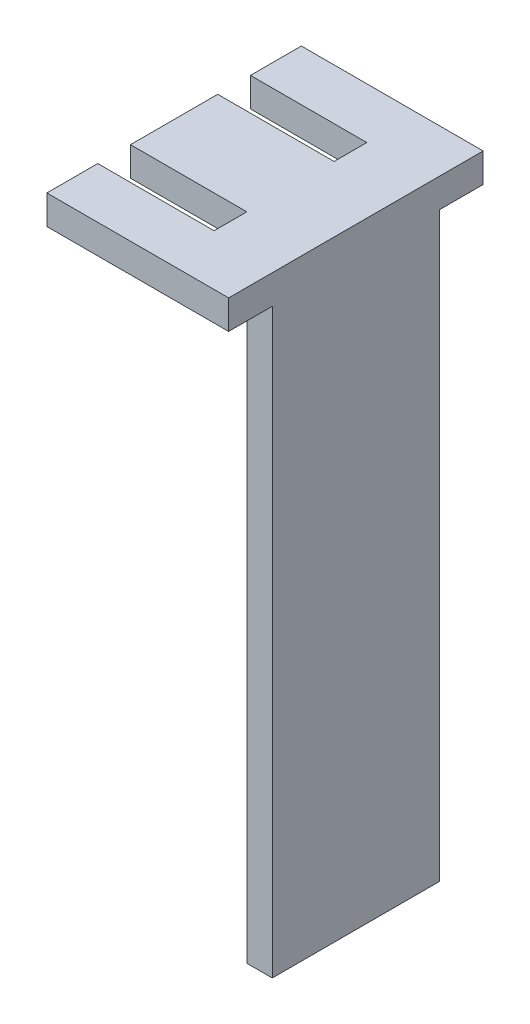
ISO-10303-21;
HEADER;
FILE_DESCRIPTION(('STEP AP214'),'2;1');
FILE_NAME('part.step','',(''),(''),'','','');
FILE_SCHEMA(('AUTOMOTIVE_DESIGN { 1 0 10303 214 1 1 1 1 }'));
ENDSEC;
DATA;
#1=APPLICATION_CONTEXT('core data for automotive mechanical design processes');
#2=APPLICATION_PROTOCOL_DEFINITION('international standard','automotive_design',2000,#1);
#3=PRODUCT_CONTEXT('',#1,'mechanical');
#4=PRODUCT('Part','Part','',(#3));
#5=PRODUCT_RELATED_PRODUCT_CATEGORY('part','',(#4));
#6=PRODUCT_DEFINITION_FORMATION('','',#4);
#7=PRODUCT_DEFINITION_CONTEXT('part definition',#1,'design');
#8=PRODUCT_DEFINITION('design','',#6,#7);
#9=PRODUCT_DEFINITION_SHAPE('','',#8);
#10=(LENGTH_UNIT() NAMED_UNIT(*) SI_UNIT(.MILLI.,.METRE.));
#11=(NAMED_UNIT(*) PLANE_ANGLE_UNIT() SI_UNIT($,.RADIAN.));
#12=(NAMED_UNIT(*) SI_UNIT($,.STERADIAN.) SOLID_ANGLE_UNIT());
#13=UNCERTAINTY_MEASURE_WITH_UNIT(LENGTH_MEASURE(1.E-05),#10,'distance_accuracy_value','');
#14=(GEOMETRIC_REPRESENTATION_CONTEXT(3) GLOBAL_UNCERTAINTY_ASSIGNED_CONTEXT((#13)) GLOBAL_UNIT_ASSIGNED_CONTEXT((#10,
#11,#12)) REPRESENTATION_CONTEXT('',''));
#15=CARTESIAN_POINT('',(0.,0.,0.));
#16=DIRECTION('',(0.,0.,1.));
#17=DIRECTION('',(1.,0.,0.));
#18=AXIS2_PLACEMENT_3D('',#15,#16,#17);
#19=CARTESIAN_POINT('',(0.,0.,0.));
#20=DIRECTION('',(0.,1.,0.));
#21=DIRECTION('',(0.,0.,1.));
#22=AXIS2_PLACEMENT_3D('',#19,#20,#21);
#23=PLANE('',#22);
#24=DIRECTION('',(-1.,0.,0.));
#25=VECTOR('',#24,1.);
#26=CARTESIAN_POINT('',(11.6483050847458,0.,16.3411016949152));
#27=LINE('',#26,#25);
#28=CARTESIAN_POINT('',(15.1483050847458,0.,16.3411016949152));
#29=VERTEX_POINT('',#28);
#30=CARTESIAN_POINT('',(11.6483050847458,0.,16.3411016949152));
#31=VERTEX_POINT('',#30);
#32=EDGE_CURVE('E169',#29,#31,#27,.T.);
#33=ORIENTED_EDGE('',*,*,#32,.F.);
#34=DIRECTION('',(0.,0.,-1.));
#35=VECTOR('',#34,1.);
#36=CARTESIAN_POINT('',(15.1483050847458,0.,-12.6588983050848));
#37=LINE('',#36,#35);
#38=CARTESIAN_POINT('',(15.1483050847458,0.,22.3411016949152));
#39=VERTEX_POINT('',#38);
#40=EDGE_CURVE('E249',#39,#29,#37,.T.);
#41=ORIENTED_EDGE('',*,*,#40,.F.);
#42=DIRECTION('',(1.,0.,0.));
#43=VECTOR('',#42,1.);
#44=CARTESIAN_POINT('',(-9.85169491525423,0.,22.3411016949152));
#45=LINE('',#44,#43);
#46=CARTESIAN_POINT('',(-9.85169491525423,0.,22.3411016949152));
#47=VERTEX_POINT('',#46);
#48=EDGE_CURVE('E245',#47,#39,#45,.T.);
#49=ORIENTED_EDGE('',*,*,#48,.F.);
#50=DIRECTION('',(0.,0.,1.));
#51=VECTOR('',#50,1.);
#52=CARTESIAN_POINT('',(-9.85169491525423,0.,-12.6588983050848));
#53=LINE('',#52,#51);
#54=CARTESIAN_POINT('',(-9.85169491525423,0.,15.3411016949152));
#55=VERTEX_POINT('',#54);
#56=EDGE_CURVE('E203',#55,#47,#53,.T.);
#57=ORIENTED_EDGE('',*,*,#56,.F.);
#58=DIRECTION('',(1.,0.,0.));
#59=VECTOR('',#58,1.);
#60=CARTESIAN_POINT('',(-9.85169491525423,0.,15.3411016949152));
#61=LINE('',#60,#59);
#62=CARTESIAN_POINT('',(6.14830508474577,0.,15.3411016949152));
#63=VERTEX_POINT('',#62);
#64=EDGE_CURVE('E181',#55,#63,#61,.T.);
#65=ORIENTED_EDGE('',*,*,#64,.T.);
#66=DIRECTION('',(0.,0.,-1.));
#67=VECTOR('',#66,1.);
#68=CARTESIAN_POINT('',(6.14830508474577,0.,10.8411016949152));
#69=LINE('',#68,#67);
#70=CARTESIAN_POINT('',(6.14830508474577,0.,10.8411016949152));
#71=VERTEX_POINT('',#70);
#72=EDGE_CURVE('E184',#63,#71,#69,.T.);
#73=ORIENTED_EDGE('',*,*,#72,.T.);
#74=DIRECTION('',(-1.,0.,0.));
#75=VECTOR('',#74,1.);
#76=CARTESIAN_POINT('',(-9.85169491525423,0.,10.8411016949152));
#77=LINE('',#76,#75);
#78=CARTESIAN_POINT('',(-9.85169491525423,0.,10.8411016949152));
#79=VERTEX_POINT('',#78);
#80=EDGE_CURVE('E188',#71,#79,#77,.T.);
#81=ORIENTED_EDGE('',*,*,#80,.T.);
#82=CARTESIAN_POINT('',(-9.85169491525423,0.,-1.15889830508476));
#83=VERTEX_POINT('',#82);
#84=EDGE_CURVE('E246',#83,#79,#53,.T.);
#85=ORIENTED_EDGE('',*,*,#84,.F.);
#86=DIRECTION('',(1.,0.,0.));
#87=VECTOR('',#86,1.);
#88=CARTESIAN_POINT('',(-9.85169491525423,0.,-1.15889830508476));
#89=LINE('',#88,#87);
#90=CARTESIAN_POINT('',(6.14830508474577,0.,-1.15889830508476));
#91=VERTEX_POINT('',#90);
#92=EDGE_CURVE('E218',#83,#91,#89,.T.);
#93=ORIENTED_EDGE('',*,*,#92,.T.);
#94=DIRECTION('',(0.,0.,-1.));
#95=VECTOR('',#94,1.);
#96=CARTESIAN_POINT('',(6.14830508474577,0.,-5.65889830508476));
#97=LINE('',#96,#95);
#98=CARTESIAN_POINT('',(6.14830508474577,0.,-5.65889830508476));
#99=VERTEX_POINT('',#98);
#100=EDGE_CURVE('E225',#91,#99,#97,.T.);
#101=ORIENTED_EDGE('',*,*,#100,.T.);
#102=DIRECTION('',(-1.,0.,0.));
#103=VECTOR('',#102,1.);
#104=CARTESIAN_POINT('',(-9.85169491525423,0.,-5.65889830508476));
#105=LINE('',#104,#103);
#106=CARTESIAN_POINT('',(-9.85169491525423,0.,-5.65889830508476));
#107=VERTEX_POINT('',#106);
#108=EDGE_CURVE('E211',#99,#107,#105,.T.);
#109=ORIENTED_EDGE('',*,*,#108,.T.);
#110=CARTESIAN_POINT('',(-9.85169491525423,0.,-12.6588983050848));
#111=VERTEX_POINT('',#110);
#112=EDGE_CURVE('E242',#111,#107,#53,.T.);
#113=ORIENTED_EDGE('',*,*,#112,.F.);
#114=DIRECTION('',(-1.,0.,0.));
#115=VECTOR('',#114,1.);
#116=CARTESIAN_POINT('',(-9.85169491525423,0.,-12.6588983050848));
#117=LINE('',#116,#115);
#118=CARTESIAN_POINT('',(15.1483050847458,0.,-12.6588983050848));
#119=VERTEX_POINT('',#118);
#120=EDGE_CURVE('E252',#119,#111,#117,.T.);
#121=ORIENTED_EDGE('',*,*,#120,.F.);
#122=CARTESIAN_POINT('',(15.1483050847458,0.,-6.65889830508475));
#123=VERTEX_POINT('',#122);
#124=EDGE_CURVE('E248',#123,#119,#37,.T.);
#125=ORIENTED_EDGE('',*,*,#124,.F.);
#126=DIRECTION('',(1.,0.,0.));
#127=VECTOR('',#126,1.);
#128=CARTESIAN_POINT('',(11.6483050847458,0.,-6.65889830508475));
#129=LINE('',#128,#127);
#130=CARTESIAN_POINT('',(11.6483050847458,0.,-6.65889830508475));
#131=VERTEX_POINT('',#130);
#132=EDGE_CURVE('E59',#131,#123,#129,.T.);
#133=ORIENTED_EDGE('',*,*,#132,.F.);
#134=DIRECTION('',(0.,0.,-1.));
#135=VECTOR('',#134,1.);
#136=CARTESIAN_POINT('',(11.6483050847458,0.,16.3411016949152));
#137=LINE('',#136,#135);
#138=EDGE_CURVE('E54',#31,#131,#137,.T.);
#139=ORIENTED_EDGE('',*,*,#138,.F.);
#140=EDGE_LOOP('',(#33,#41,#49,#57,#65,#73,#81,#85,#93,#101,#109,#113,#121,#125,#133,#139));
#141=FACE_BOUND('',#140,.T.);
#142=ADVANCED_FACE('F39',(#141),#23,.F.);
#143=CARTESIAN_POINT('',(-9.85169491525423,4.,-12.6588983050848));
#144=DIRECTION('',(1.,0.,0.));
#145=DIRECTION('',(0.,0.,-1.));
#146=AXIS2_PLACEMENT_3D('',#143,#144,#145);
#147=PLANE('',#146);
#148=ORIENTED_EDGE('',*,*,#84,.T.);
#149=DIRECTION('',(0.,1.,0.));
#150=VECTOR('',#149,1.);
#151=CARTESIAN_POINT('',(-9.85169491525423,0.,10.8411016949152));
#152=LINE('',#151,#150);
#153=CARTESIAN_POINT('',(-9.85169491525423,4.,10.8411016949152));
#154=VERTEX_POINT('',#153);
#155=EDGE_CURVE('E200',#79,#154,#152,.T.);
#156=ORIENTED_EDGE('',*,*,#155,.T.);
#157=DIRECTION('',(0.,0.,1.));
#158=VECTOR('',#157,1.);
#159=CARTESIAN_POINT('',(-9.85169491525423,4.,-12.6588983050848));
#160=LINE('',#159,#158);
#161=CARTESIAN_POINT('',(-9.85169491525423,4.,-1.15889830508476));
#162=VERTEX_POINT('',#161);
#163=EDGE_CURVE('E234',#162,#154,#160,.T.);
#164=ORIENTED_EDGE('',*,*,#163,.F.);
#165=DIRECTION('',(0.,1.,0.));
#166=VECTOR('',#165,1.);
#167=CARTESIAN_POINT('',(-9.85169491525423,0.,-1.15889830508476));
#168=LINE('',#167,#166);
#169=EDGE_CURVE('E209',#83,#162,#168,.T.);
#170=ORIENTED_EDGE('',*,*,#169,.F.);
#171=EDGE_LOOP('',(#148,#156,#164,#170));
#172=FACE_BOUND('',#171,.T.);
#173=ADVANCED_FACE('F305',(#172),#147,.F.);
#174=ORIENTED_EDGE('',*,*,#112,.T.);
#175=DIRECTION('',(0.,1.,0.));
#176=VECTOR('',#175,1.);
#177=CARTESIAN_POINT('',(-9.85169491525423,0.,-5.65889830508476));
#178=LINE('',#177,#176);
#179=CARTESIAN_POINT('',(-9.85169491525423,4.,-5.65889830508476));
#180=VERTEX_POINT('',#179);
#181=EDGE_CURVE('E172',#107,#180,#178,.T.);
#182=ORIENTED_EDGE('',*,*,#181,.T.);
#183=CARTESIAN_POINT('',(-9.85169491525423,4.,-12.6588983050848));
#184=VERTEX_POINT('',#183);
#185=EDGE_CURVE('E230',#184,#180,#160,.T.);
#186=ORIENTED_EDGE('',*,*,#185,.F.);
#187=DIRECTION('',(0.,-1.,0.));
#188=VECTOR('',#187,1.);
#189=CARTESIAN_POINT('',(-9.85169491525423,4.,-12.6588983050848));
#190=LINE('',#189,#188);
#191=EDGE_CURVE('E241',#184,#111,#190,.T.);
#192=ORIENTED_EDGE('',*,*,#191,.T.);
#193=EDGE_LOOP('',(#174,#182,#186,#192));
#194=FACE_BOUND('',#193,.T.);
#195=ADVANCED_FACE('F288',(#194),#147,.F.);
#196=CARTESIAN_POINT('',(-9.85169491525423,4.,15.3411016949152));
#197=VERTEX_POINT('',#196);
#198=CARTESIAN_POINT('',(-9.85169491525423,4.,22.3411016949152));
#199=VERTEX_POINT('',#198);
#200=EDGE_CURVE('E235',#197,#199,#160,.T.);
#201=ORIENTED_EDGE('',*,*,#200,.F.);
#202=DIRECTION('',(0.,1.,0.));
#203=VECTOR('',#202,1.);
#204=CARTESIAN_POINT('',(-9.85169491525423,0.,15.3411016949152));
#205=LINE('',#204,#203);
#206=EDGE_CURVE('E191',#55,#197,#205,.T.);
#207=ORIENTED_EDGE('',*,*,#206,.F.);
#208=ORIENTED_EDGE('',*,*,#56,.T.);
#209=DIRECTION('',(0.,-1.,0.));
#210=VECTOR('',#209,1.);
#211=CARTESIAN_POINT('',(-9.85169491525423,4.,22.3411016949152));
#212=LINE('',#211,#210);
#213=EDGE_CURVE('E11',#199,#47,#212,.T.);
#214=ORIENTED_EDGE('',*,*,#213,.F.);
#215=EDGE_LOOP('',(#201,#207,#208,#214));
#216=FACE_BOUND('',#215,.T.);
#217=ADVANCED_FACE('F41',(#216),#147,.F.);
#218=CARTESIAN_POINT('',(-9.85169491525423,4.,22.3411016949152));
#219=DIRECTION('',(0.,0.,-1.));
#220=DIRECTION('',(-1.,0.,0.));
#221=AXIS2_PLACEMENT_3D('',#218,#219,#220);
#222=PLANE('',#221);
#223=ORIENTED_EDGE('',*,*,#48,.T.);
#224=DIRECTION('',(0.,-1.,0.));
#225=VECTOR('',#224,1.);
#226=CARTESIAN_POINT('',(15.1483050847458,4.,22.3411016949152));
#227=LINE('',#226,#225);
#228=CARTESIAN_POINT('',(15.1483050847458,4.,22.3411016949152));
#229=VERTEX_POINT('',#228);
#230=EDGE_CURVE('E47',#229,#39,#227,.T.);
#231=ORIENTED_EDGE('',*,*,#230,.F.);
#232=DIRECTION('',(1.,0.,0.));
#233=VECTOR('',#232,1.);
#234=CARTESIAN_POINT('',(-9.85169491525423,4.,22.3411016949152));
#235=LINE('',#234,#233);
#236=EDGE_CURVE('E233',#199,#229,#235,.T.);
#237=ORIENTED_EDGE('',*,*,#236,.F.);
#238=ORIENTED_EDGE('',*,*,#213,.T.);
#239=EDGE_LOOP('',(#223,#231,#237,#238));
#240=FACE_BOUND('',#239,.T.);
#241=ADVANCED_FACE('F298',(#240),#222,.F.);
#242=CARTESIAN_POINT('',(15.1483050847458,4.,-12.6588983050848));
#243=DIRECTION('',(-1.,0.,0.));
#244=DIRECTION('',(0.,0.,1.));
#245=AXIS2_PLACEMENT_3D('',#242,#243,#244);
#246=PLANE('',#245);
#247=ORIENTED_EDGE('',*,*,#40,.T.);
#248=DIRECTION('',(0.,1.,0.));
#249=VECTOR('',#248,1.);
#250=CARTESIAN_POINT('',(15.1483050847458,-80.,16.3411016949152));
#251=LINE('',#250,#249);
#252=CARTESIAN_POINT('',(15.1483050847458,-80.,16.3411016949152));
#253=VERTEX_POINT('',#252);
#254=EDGE_CURVE('E177',#253,#29,#251,.T.);
#255=ORIENTED_EDGE('',*,*,#254,.F.);
#256=DIRECTION('',(0.,0.,1.));
#257=VECTOR('',#256,1.);
#258=CARTESIAN_POINT('',(15.1483050847458,-80.,16.3411016949152));
#259=LINE('',#258,#257);
#260=CARTESIAN_POINT('',(15.1483050847458,-80.,-6.65889830508475));
#261=VERTEX_POINT('',#260);
#262=EDGE_CURVE('E159',#261,#253,#259,.T.);
#263=ORIENTED_EDGE('',*,*,#262,.F.);
#264=DIRECTION('',(0.,1.,0.));
#265=VECTOR('',#264,1.);
#266=CARTESIAN_POINT('',(15.1483050847458,-80.,-6.65889830508475));
#267=LINE('',#266,#265);
#268=EDGE_CURVE('E156',#261,#123,#267,.T.);
#269=ORIENTED_EDGE('',*,*,#268,.T.);
#270=ORIENTED_EDGE('',*,*,#124,.T.);
#271=DIRECTION('',(0.,-1.,0.));
#272=VECTOR('',#271,1.);
#273=CARTESIAN_POINT('',(15.1483050847458,4.,-12.6588983050848));
#274=LINE('',#273,#272);
#275=CARTESIAN_POINT('',(15.1483050847458,4.,-12.6588983050848));
#276=VERTEX_POINT('',#275);
#277=EDGE_CURVE('E256',#276,#119,#274,.T.);
#278=ORIENTED_EDGE('',*,*,#277,.F.);
#279=DIRECTION('',(0.,0.,-1.));
#280=VECTOR('',#279,1.);
#281=CARTESIAN_POINT('',(15.1483050847458,4.,-12.6588983050848));
#282=LINE('',#281,#280);
#283=EDGE_CURVE('E237',#229,#276,#282,.T.);
#284=ORIENTED_EDGE('',*,*,#283,.F.);
#285=ORIENTED_EDGE('',*,*,#230,.T.);
#286=EDGE_LOOP('',(#247,#255,#263,#269,#270,#278,#284,#285));
#287=FACE_BOUND('',#286,.T.);
#288=ADVANCED_FACE('F263',(#287),#246,.F.);
#289=CARTESIAN_POINT('',(-9.85169491525423,4.,-12.6588983050848));
#290=DIRECTION('',(0.,0.,1.));
#291=DIRECTION('',(1.,0.,0.));
#292=AXIS2_PLACEMENT_3D('',#289,#290,#291);
#293=PLANE('',#292);
#294=ORIENTED_EDGE('',*,*,#120,.T.);
#295=ORIENTED_EDGE('',*,*,#191,.F.);
#296=DIRECTION('',(-1.,0.,0.));
#297=VECTOR('',#296,1.);
#298=CARTESIAN_POINT('',(-9.85169491525423,4.,-12.6588983050848));
#299=LINE('',#298,#297);
#300=EDGE_CURVE('E239',#276,#184,#299,.T.);
#301=ORIENTED_EDGE('',*,*,#300,.F.);
#302=ORIENTED_EDGE('',*,*,#277,.T.);
#303=EDGE_LOOP('',(#294,#295,#301,#302));
#304=FACE_BOUND('',#303,.T.);
#305=ADVANCED_FACE('F283',(#304),#293,.F.);
#306=CARTESIAN_POINT('',(0.,4.,0.));
#307=DIRECTION('',(0.,1.,0.));
#308=DIRECTION('',(0.,0.,1.));
#309=AXIS2_PLACEMENT_3D('',#306,#307,#308);
#310=PLANE('',#309);
#311=DIRECTION('',(-1.,0.,0.));
#312=VECTOR('',#311,1.);
#313=CARTESIAN_POINT('',(-9.85169491525423,4.,10.8411016949152));
#314=LINE('',#313,#312);
#315=CARTESIAN_POINT('',(6.14830508474577,4.,10.8411016949152));
#316=VERTEX_POINT('',#315);
#317=EDGE_CURVE('E185',#316,#154,#314,.T.);
#318=ORIENTED_EDGE('',*,*,#317,.F.);
#319=DIRECTION('',(0.,0.,-1.));
#320=VECTOR('',#319,1.);
#321=CARTESIAN_POINT('',(6.14830508474577,4.,10.8411016949152));
#322=LINE('',#321,#320);
#323=CARTESIAN_POINT('',(6.14830508474577,4.,15.3411016949152));
#324=VERTEX_POINT('',#323);
#325=EDGE_CURVE('E195',#324,#316,#322,.T.);
#326=ORIENTED_EDGE('',*,*,#325,.F.);
#327=DIRECTION('',(1.,0.,0.));
#328=VECTOR('',#327,1.);
#329=CARTESIAN_POINT('',(-9.85169491525423,4.,15.3411016949152));
#330=LINE('',#329,#328);
#331=EDGE_CURVE('E192',#197,#324,#330,.T.);
#332=ORIENTED_EDGE('',*,*,#331,.F.);
#333=ORIENTED_EDGE('',*,*,#200,.T.);
#334=ORIENTED_EDGE('',*,*,#236,.T.);
#335=ORIENTED_EDGE('',*,*,#283,.T.);
#336=ORIENTED_EDGE('',*,*,#300,.T.);
#337=ORIENTED_EDGE('',*,*,#185,.T.);
#338=DIRECTION('',(-1.,0.,0.));
#339=VECTOR('',#338,1.);
#340=CARTESIAN_POINT('',(-9.85169491525423,4.,-5.65889830508476));
#341=LINE('',#340,#339);
#342=CARTESIAN_POINT('',(6.14830508474577,4.,-5.65889830508476));
#343=VERTEX_POINT('',#342);
#344=EDGE_CURVE('E215',#343,#180,#341,.T.);
#345=ORIENTED_EDGE('',*,*,#344,.F.);
#346=DIRECTION('',(0.,0.,-1.));
#347=VECTOR('',#346,1.);
#348=CARTESIAN_POINT('',(6.14830508474577,4.,-5.65889830508476));
#349=LINE('',#348,#347);
#350=CARTESIAN_POINT('',(6.14830508474577,4.,-1.15889830508476));
#351=VERTEX_POINT('',#350);
#352=EDGE_CURVE('E217',#351,#343,#349,.T.);
#353=ORIENTED_EDGE('',*,*,#352,.F.);
#354=DIRECTION('',(1.,0.,0.));
#355=VECTOR('',#354,1.);
#356=CARTESIAN_POINT('',(-9.85169491525423,4.,-1.15889830508476));
#357=LINE('',#356,#355);
#358=EDGE_CURVE('E196',#162,#351,#357,.T.);
#359=ORIENTED_EDGE('',*,*,#358,.F.);
#360=ORIENTED_EDGE('',*,*,#163,.T.);
#361=EDGE_LOOP('',(#318,#326,#332,#333,#334,#335,#336,#337,#345,#353,#359,#360));
#362=FACE_BOUND('',#361,.T.);
#363=ADVANCED_FACE('F293',(#362),#310,.T.);
#364=CARTESIAN_POINT('',(-9.85169491525423,0.,-5.65889830508476));
#365=DIRECTION('',(0.,0.,-1.));
#366=DIRECTION('',(-1.,0.,0.));
#367=AXIS2_PLACEMENT_3D('',#364,#365,#366);
#368=PLANE('',#367);
#369=ORIENTED_EDGE('',*,*,#344,.T.);
#370=ORIENTED_EDGE('',*,*,#181,.F.);
#371=ORIENTED_EDGE('',*,*,#108,.F.);
#372=DIRECTION('',(0.,1.,0.));
#373=VECTOR('',#372,1.);
#374=CARTESIAN_POINT('',(6.14830508474577,0.,-5.65889830508476));
#375=LINE('',#374,#373);
#376=EDGE_CURVE('E175',#99,#343,#375,.T.);
#377=ORIENTED_EDGE('',*,*,#376,.T.);
#378=EDGE_LOOP('',(#369,#370,#371,#377));
#379=FACE_BOUND('',#378,.T.);
#380=ADVANCED_FACE('F319',(#379),#368,.F.);
#381=CARTESIAN_POINT('',(6.14830508474577,0.,-5.65889830508476));
#382=DIRECTION('',(1.,0.,0.));
#383=DIRECTION('',(0.,0.,-1.));
#384=AXIS2_PLACEMENT_3D('',#381,#382,#383);
#385=PLANE('',#384);
#386=ORIENTED_EDGE('',*,*,#352,.T.);
#387=ORIENTED_EDGE('',*,*,#376,.F.);
#388=ORIENTED_EDGE('',*,*,#100,.F.);
#389=DIRECTION('',(0.,1.,0.));
#390=VECTOR('',#389,1.);
#391=CARTESIAN_POINT('',(6.14830508474577,0.,-1.15889830508476));
#392=LINE('',#391,#390);
#393=EDGE_CURVE('E212',#91,#351,#392,.T.);
#394=ORIENTED_EDGE('',*,*,#393,.T.);
#395=EDGE_LOOP('',(#386,#387,#388,#394));
#396=FACE_BOUND('',#395,.T.);
#397=ADVANCED_FACE('F317',(#396),#385,.F.);
#398=CARTESIAN_POINT('',(-9.85169491525423,0.,-1.15889830508476));
#399=DIRECTION('',(0.,0.,1.));
#400=DIRECTION('',(1.,0.,0.));
#401=AXIS2_PLACEMENT_3D('',#398,#399,#400);
#402=PLANE('',#401);
#403=ORIENTED_EDGE('',*,*,#358,.T.);
#404=ORIENTED_EDGE('',*,*,#393,.F.);
#405=ORIENTED_EDGE('',*,*,#92,.F.);
#406=ORIENTED_EDGE('',*,*,#169,.T.);
#407=EDGE_LOOP('',(#403,#404,#405,#406));
#408=FACE_BOUND('',#407,.T.);
#409=ADVANCED_FACE('F315',(#408),#402,.F.);
#410=CARTESIAN_POINT('',(-9.85169491525423,0.,10.8411016949152));
#411=DIRECTION('',(0.,0.,-1.));
#412=DIRECTION('',(-1.,0.,0.));
#413=AXIS2_PLACEMENT_3D('',#410,#411,#412);
#414=PLANE('',#413);
#415=ORIENTED_EDGE('',*,*,#317,.T.);
#416=ORIENTED_EDGE('',*,*,#155,.F.);
#417=ORIENTED_EDGE('',*,*,#80,.F.);
#418=DIRECTION('',(0.,1.,0.));
#419=VECTOR('',#418,1.);
#420=CARTESIAN_POINT('',(6.14830508474577,0.,10.8411016949152));
#421=LINE('',#420,#419);
#422=EDGE_CURVE('E204',#71,#316,#421,.T.);
#423=ORIENTED_EDGE('',*,*,#422,.T.);
#424=EDGE_LOOP('',(#415,#416,#417,#423));
#425=FACE_BOUND('',#424,.T.);
#426=ADVANCED_FACE('F310',(#425),#414,.F.);
#427=CARTESIAN_POINT('',(6.14830508474577,0.,10.8411016949152));
#428=DIRECTION('',(1.,0.,0.));
#429=DIRECTION('',(0.,0.,-1.));
#430=AXIS2_PLACEMENT_3D('',#427,#428,#429);
#431=PLANE('',#430);
#432=ORIENTED_EDGE('',*,*,#325,.T.);
#433=ORIENTED_EDGE('',*,*,#422,.F.);
#434=ORIENTED_EDGE('',*,*,#72,.F.);
#435=DIRECTION('',(0.,1.,0.));
#436=VECTOR('',#435,1.);
#437=CARTESIAN_POINT('',(6.14830508474577,0.,15.3411016949152));
#438=LINE('',#437,#436);
#439=EDGE_CURVE('E206',#63,#324,#438,.T.);
#440=ORIENTED_EDGE('',*,*,#439,.T.);
#441=EDGE_LOOP('',(#432,#433,#434,#440));
#442=FACE_BOUND('',#441,.T.);
#443=ADVANCED_FACE('F398',(#442),#431,.F.);
#444=CARTESIAN_POINT('',(-9.85169491525423,0.,15.3411016949152));
#445=DIRECTION('',(0.,0.,1.));
#446=DIRECTION('',(1.,0.,0.));
#447=AXIS2_PLACEMENT_3D('',#444,#445,#446);
#448=PLANE('',#447);
#449=ORIENTED_EDGE('',*,*,#331,.T.);
#450=ORIENTED_EDGE('',*,*,#439,.F.);
#451=ORIENTED_EDGE('',*,*,#64,.F.);
#452=ORIENTED_EDGE('',*,*,#206,.T.);
#453=EDGE_LOOP('',(#449,#450,#451,#452));
#454=FACE_BOUND('',#453,.T.);
#455=ADVANCED_FACE('F407',(#454),#448,.F.);
#456=CARTESIAN_POINT('',(11.6483050847458,-80.,16.3411016949152));
#457=DIRECTION('',(1.,0.,0.));
#458=DIRECTION('',(0.,0.,-1.));
#459=AXIS2_PLACEMENT_3D('',#456,#457,#458);
#460=PLANE('',#459);
#461=ORIENTED_EDGE('',*,*,#138,.T.);
#462=DIRECTION('',(0.,1.,0.));
#463=VECTOR('',#462,1.);
#464=CARTESIAN_POINT('',(11.6483050847458,-80.,-6.65889830508475));
#465=LINE('',#464,#463);
#466=CARTESIAN_POINT('',(11.6483050847458,-80.,-6.65889830508475));
#467=VERTEX_POINT('',#466);
#468=EDGE_CURVE('E154',#467,#131,#465,.T.);
#469=ORIENTED_EDGE('',*,*,#468,.F.);
#470=DIRECTION('',(0.,0.,-1.));
#471=VECTOR('',#470,1.);
#472=CARTESIAN_POINT('',(11.6483050847458,-80.,16.3411016949152));
#473=LINE('',#472,#471);
#474=CARTESIAN_POINT('',(11.6483050847458,-80.,16.3411016949152));
#475=VERTEX_POINT('',#474);
#476=EDGE_CURVE('E160',#475,#467,#473,.T.);
#477=ORIENTED_EDGE('',*,*,#476,.F.);
#478=DIRECTION('',(0.,1.,0.));
#479=VECTOR('',#478,1.);
#480=CARTESIAN_POINT('',(11.6483050847458,-80.,16.3411016949152));
#481=LINE('',#480,#479);
#482=EDGE_CURVE('E276',#475,#31,#481,.T.);
#483=ORIENTED_EDGE('',*,*,#482,.T.);
#484=EDGE_LOOP('',(#461,#469,#477,#483));
#485=FACE_BOUND('',#484,.T.);
#486=ADVANCED_FACE('F171',(#485),#460,.F.);
#487=CARTESIAN_POINT('',(11.6483050847458,-80.,-6.65889830508475));
#488=DIRECTION('',(0.,0.,1.));
#489=DIRECTION('',(1.,0.,0.));
#490=AXIS2_PLACEMENT_3D('',#487,#488,#489);
#491=PLANE('',#490);
#492=ORIENTED_EDGE('',*,*,#132,.T.);
#493=ORIENTED_EDGE('',*,*,#268,.F.);
#494=DIRECTION('',(1.,0.,0.));
#495=VECTOR('',#494,1.);
#496=CARTESIAN_POINT('',(11.6483050847458,-80.,-6.65889830508475));
#497=LINE('',#496,#495);
#498=EDGE_CURVE('E150',#467,#261,#497,.T.);
#499=ORIENTED_EDGE('',*,*,#498,.F.);
#500=ORIENTED_EDGE('',*,*,#468,.T.);
#501=EDGE_LOOP('',(#492,#493,#499,#500));
#502=FACE_BOUND('',#501,.T.);
#503=ADVANCED_FACE('F152',(#502),#491,.F.);
#504=CARTESIAN_POINT('',(11.6483050847458,-80.,16.3411016949152));
#505=DIRECTION('',(0.,0.,-1.));
#506=DIRECTION('',(-1.,0.,0.));
#507=AXIS2_PLACEMENT_3D('',#504,#505,#506);
#508=PLANE('',#507);
#509=ORIENTED_EDGE('',*,*,#32,.T.);
#510=ORIENTED_EDGE('',*,*,#482,.F.);
#511=DIRECTION('',(-1.,0.,0.));
#512=VECTOR('',#511,1.);
#513=CARTESIAN_POINT('',(11.6483050847458,-80.,16.3411016949152));
#514=LINE('',#513,#512);
#515=EDGE_CURVE('E165',#253,#475,#514,.T.);
#516=ORIENTED_EDGE('',*,*,#515,.F.);
#517=ORIENTED_EDGE('',*,*,#254,.T.);
#518=EDGE_LOOP('',(#509,#510,#516,#517));
#519=FACE_BOUND('',#518,.T.);
#520=ADVANCED_FACE('F277',(#519),#508,.F.);
#521=CARTESIAN_POINT('',(0.,-80.,0.));
#522=DIRECTION('',(0.,-1.,0.));
#523=DIRECTION('',(0.,0.,-1.));
#524=AXIS2_PLACEMENT_3D('',#521,#522,#523);
#525=PLANE('',#524);
#526=ORIENTED_EDGE('',*,*,#476,.T.);
#527=ORIENTED_EDGE('',*,*,#498,.T.);
#528=ORIENTED_EDGE('',*,*,#262,.T.);
#529=ORIENTED_EDGE('',*,*,#515,.T.);
#530=EDGE_LOOP('',(#526,#527,#528,#529));
#531=FACE_BOUND('',#530,.T.);
#532=ADVANCED_FACE('F163',(#531),#525,.T.);
#533=CLOSED_SHELL('',(#142,#173,#195,#217,#241,#288,#305,#363,#380,#397,#409,#426,#443,#455,
#486,#503,#520,#532));
#534=MANIFOLD_SOLID_BREP('B2',#533);
#535=ADVANCED_BREP_SHAPE_REPRESENTATION('',(#18,#534),#14);
#536=SHAPE_DEFINITION_REPRESENTATION(#9,#535);
ENDSEC;
END-ISO-10303-21;
